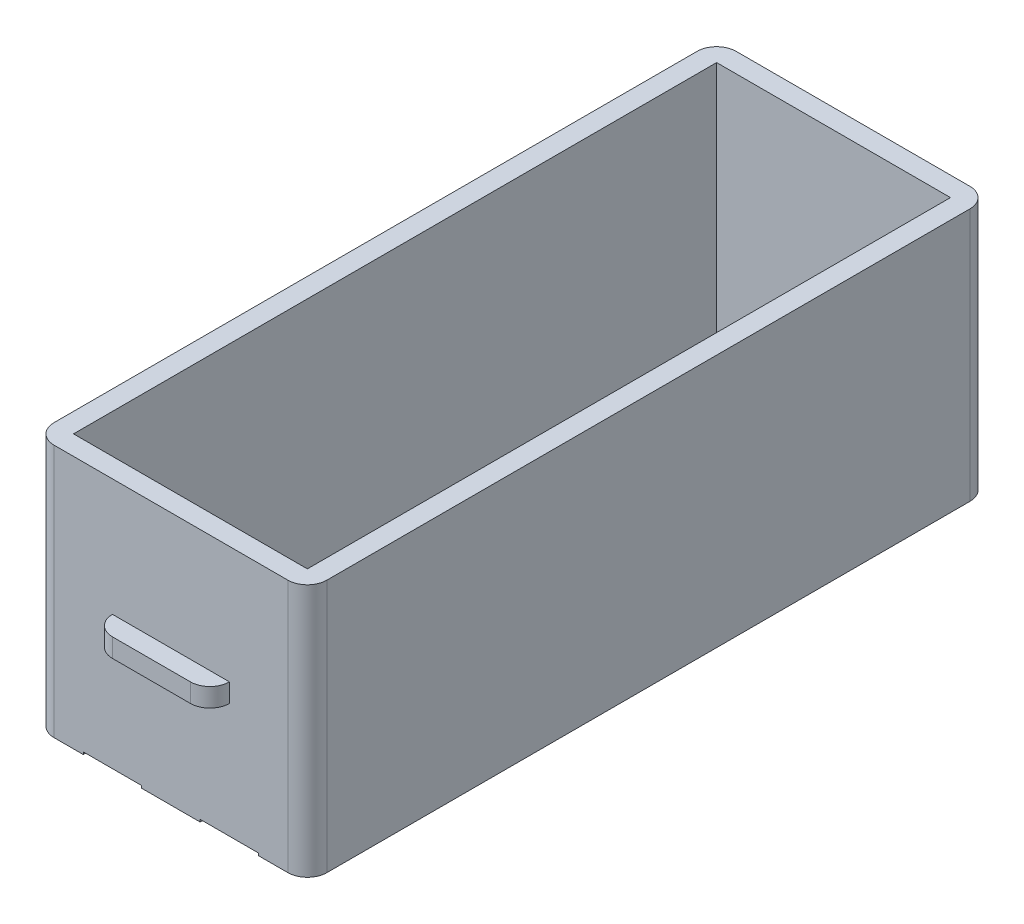
ISO-10303-21;
HEADER;
FILE_DESCRIPTION(('STEP AP214'),'2;1');
FILE_NAME('part.step','',(''),(''),'','','');
FILE_SCHEMA(('AUTOMOTIVE_DESIGN { 1 0 10303 214 1 1 1 1 }'));
ENDSEC;
DATA;
#1=APPLICATION_CONTEXT('core data for automotive mechanical design processes');
#2=APPLICATION_PROTOCOL_DEFINITION('international standard','automotive_design',2000,#1);
#3=PRODUCT_CONTEXT('',#1,'mechanical');
#4=PRODUCT('Part','Part','',(#3));
#5=PRODUCT_RELATED_PRODUCT_CATEGORY('part','',(#4));
#6=PRODUCT_DEFINITION_FORMATION('','',#4);
#7=PRODUCT_DEFINITION_CONTEXT('part definition',#1,'design');
#8=PRODUCT_DEFINITION('design','',#6,#7);
#9=PRODUCT_DEFINITION_SHAPE('','',#8);
#10=(LENGTH_UNIT() NAMED_UNIT(*) SI_UNIT(.MILLI.,.METRE.));
#11=(NAMED_UNIT(*) PLANE_ANGLE_UNIT() SI_UNIT($,.RADIAN.));
#12=(NAMED_UNIT(*) SI_UNIT($,.STERADIAN.) SOLID_ANGLE_UNIT());
#13=UNCERTAINTY_MEASURE_WITH_UNIT(LENGTH_MEASURE(1.E-05),#10,'distance_accuracy_value','');
#14=(GEOMETRIC_REPRESENTATION_CONTEXT(3) GLOBAL_UNCERTAINTY_ASSIGNED_CONTEXT((#13)) GLOBAL_UNIT_ASSIGNED_CONTEXT((#10,
#11,#12)) REPRESENTATION_CONTEXT('',''));
#15=CARTESIAN_POINT('',(0.,0.,0.));
#16=DIRECTION('',(0.,0.,1.));
#17=DIRECTION('',(1.,0.,0.));
#18=AXIS2_PLACEMENT_3D('',#15,#16,#17);
#19=CARTESIAN_POINT('',(-44.45,-41.275,111.125));
#20=DIRECTION('',(0.,1.,0.));
#21=DIRECTION('',(0.,0.,1.));
#22=AXIS2_PLACEMENT_3D('',#19,#20,#21);
#23=PLANE('',#22);
#24=DIRECTION('',(0.,0.,-1.));
#25=VECTOR('',#24,1.);
#26=CARTESIAN_POINT('',(-44.45,-41.275,111.125));
#27=LINE('',#26,#25);
#28=CARTESIAN_POINT('',(-44.45,-41.275,104.775));
#29=VERTEX_POINT('',#28);
#30=CARTESIAN_POINT('',(-44.45,-41.275,-104.775));
#31=VERTEX_POINT('',#30);
#32=EDGE_CURVE('E247',#29,#31,#27,.T.);
#33=ORIENTED_EDGE('',*,*,#32,.T.);
#34=CARTESIAN_POINT('',(-38.1,-41.275,-104.775));
#35=DIRECTION('',(0.,1.,0.));
#36=DIRECTION('',(0.,0.,1.));
#37=AXIS2_PLACEMENT_3D('',#34,#35,#36);
#38=CIRCLE('',#37,6.35);
#39=CARTESIAN_POINT('',(-38.1,-41.275,-111.125));
#40=VERTEX_POINT('',#39);
#41=EDGE_CURVE('E281',#31,#40,#38,.F.);
#42=ORIENTED_EDGE('',*,*,#41,.T.);
#43=DIRECTION('',(1.,0.,0.));
#44=VECTOR('',#43,1.);
#45=CARTESIAN_POINT('',(-44.45,-41.275,-111.125));
#46=LINE('',#45,#44);
#47=CARTESIAN_POINT('',(-28.575,-41.275,-111.125));
#48=VERTEX_POINT('',#47);
#49=EDGE_CURVE('E231',#40,#48,#46,.T.);
#50=ORIENTED_EDGE('',*,*,#49,.T.);
#51=DIRECTION('',(0.,0.,1.));
#52=VECTOR('',#51,1.);
#53=CARTESIAN_POINT('',(-28.575,-41.275,-111.125));
#54=LINE('',#53,#52);
#55=CARTESIAN_POINT('',(-28.575,-41.275,111.125));
#56=VERTEX_POINT('',#55);
#57=EDGE_CURVE('E400',#48,#56,#54,.T.);
#58=ORIENTED_EDGE('',*,*,#57,.T.);
#59=DIRECTION('',(1.,0.,0.));
#60=VECTOR('',#59,1.);
#61=CARTESIAN_POINT('',(-44.45,-41.275,111.125));
#62=LINE('',#61,#60);
#63=CARTESIAN_POINT('',(-38.1,-41.275,111.125));
#64=VERTEX_POINT('',#63);
#65=EDGE_CURVE('E244',#64,#56,#62,.T.);
#66=ORIENTED_EDGE('',*,*,#65,.F.);
#67=CARTESIAN_POINT('',(-38.1,-41.275,104.775));
#68=DIRECTION('',(0.,1.,0.));
#69=DIRECTION('',(0.,0.,1.));
#70=AXIS2_PLACEMENT_3D('',#67,#68,#69);
#71=CIRCLE('',#70,6.35);
#72=EDGE_CURVE('E279',#64,#29,#71,.F.);
#73=ORIENTED_EDGE('',*,*,#72,.T.);
#74=EDGE_LOOP('',(#33,#42,#50,#58,#66,#73));
#75=FACE_BOUND('',#74,.T.);
#76=ADVANCED_FACE('F42',(#75),#23,.F.);
#77=CARTESIAN_POINT('',(28.575,-41.275,-111.125));
#78=VERTEX_POINT('',#77);
#79=CARTESIAN_POINT('',(38.1,-41.275,-111.125));
#80=VERTEX_POINT('',#79);
#81=EDGE_CURVE('E232',#78,#80,#46,.T.);
#82=ORIENTED_EDGE('',*,*,#81,.T.);
#83=CARTESIAN_POINT('',(38.1,-41.275,-104.775));
#84=DIRECTION('',(0.,1.,0.));
#85=DIRECTION('',(0.,0.,1.));
#86=AXIS2_PLACEMENT_3D('',#83,#84,#85);
#87=CIRCLE('',#86,6.35);
#88=CARTESIAN_POINT('',(44.45,-41.275,-104.775));
#89=VERTEX_POINT('',#88);
#90=EDGE_CURVE('E272',#80,#89,#87,.F.);
#91=ORIENTED_EDGE('',*,*,#90,.T.);
#92=DIRECTION('',(0.,0.,-1.));
#93=VECTOR('',#92,1.);
#94=CARTESIAN_POINT('',(44.45,-41.275,111.125));
#95=LINE('',#94,#93);
#96=CARTESIAN_POINT('',(44.45,-41.275,104.775));
#97=VERTEX_POINT('',#96);
#98=EDGE_CURVE('E243',#97,#89,#95,.T.);
#99=ORIENTED_EDGE('',*,*,#98,.F.);
#100=CARTESIAN_POINT('',(38.1,-41.275,104.775));
#101=DIRECTION('',(0.,1.,0.));
#102=DIRECTION('',(0.,0.,1.));
#103=AXIS2_PLACEMENT_3D('',#100,#101,#102);
#104=CIRCLE('',#103,6.35);
#105=CARTESIAN_POINT('',(38.1,-41.275,111.125));
#106=VERTEX_POINT('',#105);
#107=EDGE_CURVE('E270',#97,#106,#104,.F.);
#108=ORIENTED_EDGE('',*,*,#107,.T.);
#109=CARTESIAN_POINT('',(28.575,-41.275,111.125));
#110=VERTEX_POINT('',#109);
#111=EDGE_CURVE('E349',#110,#106,#62,.T.);
#112=ORIENTED_EDGE('',*,*,#111,.F.);
#113=DIRECTION('',(0.,0.,1.));
#114=VECTOR('',#113,1.);
#115=CARTESIAN_POINT('',(28.575,-41.275,-111.125));
#116=LINE('',#115,#114);
#117=EDGE_CURVE('E418',#78,#110,#116,.T.);
#118=ORIENTED_EDGE('',*,*,#117,.F.);
#119=EDGE_LOOP('',(#82,#91,#99,#108,#112,#118));
#120=FACE_BOUND('',#119,.T.);
#121=ADVANCED_FACE('F455',(#120),#23,.F.);
#122=CARTESIAN_POINT('',(0.,0.,111.125));
#123=DIRECTION('',(0.,0.,1.));
#124=DIRECTION('',(1.,0.,0.));
#125=AXIS2_PLACEMENT_3D('',#122,#123,#124);
#126=PLANE('',#125);
#127=DIRECTION('',(-1.,0.,0.));
#128=VECTOR('',#127,1.);
#129=CARTESIAN_POINT('',(44.45,41.275,111.125));
#130=LINE('',#129,#128);
#131=CARTESIAN_POINT('',(38.1,41.275,111.125));
#132=VERTEX_POINT('',#131);
#133=CARTESIAN_POINT('',(-38.1,41.275,111.125));
#134=VERTEX_POINT('',#133);
#135=EDGE_CURVE('E234',#132,#134,#130,.T.);
#136=ORIENTED_EDGE('',*,*,#135,.T.);
#137=DIRECTION('',(0.,-1.,0.));
#138=VECTOR('',#137,1.);
#139=CARTESIAN_POINT('',(-38.1,-41.275,111.125));
#140=LINE('',#139,#138);
#141=EDGE_CURVE('E286',#134,#64,#140,.T.);
#142=ORIENTED_EDGE('',*,*,#141,.T.);
#143=ORIENTED_EDGE('',*,*,#65,.T.);
#144=DIRECTION('',(0.,-1.,0.));
#145=VECTOR('',#144,1.);
#146=CARTESIAN_POINT('',(-28.575,-41.275,111.125));
#147=LINE('',#146,#145);
#148=CARTESIAN_POINT('',(-28.575,-40.513,111.125));
#149=VERTEX_POINT('',#148);
#150=EDGE_CURVE('E213',#149,#56,#147,.T.);
#151=ORIENTED_EDGE('',*,*,#150,.F.);
#152=DIRECTION('',(-1.,0.,0.));
#153=VECTOR('',#152,1.);
#154=CARTESIAN_POINT('',(-28.575,-40.513,111.125));
#155=LINE('',#154,#153);
#156=CARTESIAN_POINT('',(-9.52499999999999,-40.513,111.125));
#157=VERTEX_POINT('',#156);
#158=EDGE_CURVE('E695',#157,#149,#155,.T.);
#159=ORIENTED_EDGE('',*,*,#158,.F.);
#160=DIRECTION('',(0.,1.,0.));
#161=VECTOR('',#160,1.);
#162=CARTESIAN_POINT('',(-9.52499999999999,-40.513,111.125));
#163=LINE('',#162,#161);
#164=CARTESIAN_POINT('',(-9.52499999999999,-41.275,111.125));
#165=VERTEX_POINT('',#164);
#166=EDGE_CURVE('E429',#165,#157,#163,.T.);
#167=ORIENTED_EDGE('',*,*,#166,.F.);
#168=CARTESIAN_POINT('',(9.52500000000001,-41.275,111.125));
#169=VERTEX_POINT('',#168);
#170=EDGE_CURVE('E222',#165,#169,#62,.T.);
#171=ORIENTED_EDGE('',*,*,#170,.T.);
#172=DIRECTION('',(0.,-1.,0.));
#173=VECTOR('',#172,1.);
#174=CARTESIAN_POINT('',(9.52500000000001,-40.513,111.125));
#175=LINE('',#174,#173);
#176=CARTESIAN_POINT('',(9.52500000000001,-40.513,111.125));
#177=VERTEX_POINT('',#176);
#178=EDGE_CURVE('E423',#177,#169,#175,.T.);
#179=ORIENTED_EDGE('',*,*,#178,.F.);
#180=DIRECTION('',(-1.,0.,0.));
#181=VECTOR('',#180,1.);
#182=CARTESIAN_POINT('',(28.575,-40.513,111.125));
#183=LINE('',#182,#181);
#184=CARTESIAN_POINT('',(28.575,-40.513,111.125));
#185=VERTEX_POINT('',#184);
#186=EDGE_CURVE('E426',#185,#177,#183,.T.);
#187=ORIENTED_EDGE('',*,*,#186,.F.);
#188=DIRECTION('',(0.,1.,0.));
#189=VECTOR('',#188,1.);
#190=CARTESIAN_POINT('',(28.575,-41.275,111.125));
#191=LINE('',#190,#189);
#192=EDGE_CURVE('E361',#110,#185,#191,.T.);
#193=ORIENTED_EDGE('',*,*,#192,.F.);
#194=ORIENTED_EDGE('',*,*,#111,.T.);
#195=DIRECTION('',(0.,1.,0.));
#196=VECTOR('',#195,1.);
#197=CARTESIAN_POINT('',(38.1,41.275,111.125));
#198=LINE('',#197,#196);
#199=EDGE_CURVE('E283',#106,#132,#198,.T.);
#200=ORIENTED_EDGE('',*,*,#199,.T.);
#201=EDGE_LOOP('',(#136,#142,#143,#151,#159,#167,#171,#179,#187,#193,#194,#200));
#202=FACE_BOUND('',#201,.T.);
#203=DIRECTION('',(0.,1.,0.));
#204=VECTOR('',#203,1.);
#205=CARTESIAN_POINT('',(-19.05,0.,111.125));
#206=LINE('',#205,#204);
#207=CARTESIAN_POINT('',(-19.05,-3.048,111.125));
#208=VERTEX_POINT('',#207);
#209=CARTESIAN_POINT('',(-19.05,3.048,111.125));
#210=VERTEX_POINT('',#209);
#211=EDGE_CURVE('E306',#208,#210,#206,.T.);
#212=ORIENTED_EDGE('',*,*,#211,.T.);
#213=DIRECTION('',(1.,0.,0.));
#214=VECTOR('',#213,1.);
#215=CARTESIAN_POINT('',(0.,3.048,111.125));
#216=LINE('',#215,#214);
#217=CARTESIAN_POINT('',(19.05,3.048,111.125));
#218=VERTEX_POINT('',#217);
#219=EDGE_CURVE('E311',#210,#218,#216,.T.);
#220=ORIENTED_EDGE('',*,*,#219,.T.);
#221=DIRECTION('',(0.,-1.,0.));
#222=VECTOR('',#221,1.);
#223=CARTESIAN_POINT('',(19.05,0.,111.125));
#224=LINE('',#223,#222);
#225=CARTESIAN_POINT('',(19.05,-3.048,111.125));
#226=VERTEX_POINT('',#225);
#227=EDGE_CURVE('E309',#218,#226,#224,.T.);
#228=ORIENTED_EDGE('',*,*,#227,.T.);
#229=DIRECTION('',(-1.,0.,0.));
#230=VECTOR('',#229,1.);
#231=CARTESIAN_POINT('',(0.,-3.048,111.125));
#232=LINE('',#231,#230);
#233=EDGE_CURVE('E299',#226,#208,#232,.T.);
#234=ORIENTED_EDGE('',*,*,#233,.T.);
#235=EDGE_LOOP('',(#212,#220,#228,#234));
#236=FACE_BOUND('',#235,.T.);
#237=ADVANCED_FACE('F304',(#202,#236),#126,.T.);
#238=CARTESIAN_POINT('',(44.45,41.275,111.125));
#239=DIRECTION('',(0.,-1.,0.));
#240=DIRECTION('',(1.,0.,0.));
#241=AXIS2_PLACEMENT_3D('',#238,#239,#240);
#242=PLANE('',#241);
#243=DIRECTION('',(0.,0.,1.));
#244=VECTOR('',#243,1.);
#245=CARTESIAN_POINT('',(-38.1,41.275,-104.775));
#246=LINE('',#245,#244);
#247=CARTESIAN_POINT('',(-38.1,41.275,-104.775));
#248=VERTEX_POINT('',#247);
#249=CARTESIAN_POINT('',(-38.1,41.275,104.775));
#250=VERTEX_POINT('',#249);
#251=EDGE_CURVE('E332',#248,#250,#246,.T.);
#252=ORIENTED_EDGE('',*,*,#251,.F.);
#253=DIRECTION('',(-1.,0.,0.));
#254=VECTOR('',#253,1.);
#255=CARTESIAN_POINT('',(38.1,41.275,-104.775));
#256=LINE('',#255,#254);
#257=CARTESIAN_POINT('',(38.1,41.275,-104.775));
#258=VERTEX_POINT('',#257);
#259=EDGE_CURVE('E313',#258,#248,#256,.T.);
#260=ORIENTED_EDGE('',*,*,#259,.F.);
#261=DIRECTION('',(0.,0.,-1.));
#262=VECTOR('',#261,1.);
#263=CARTESIAN_POINT('',(38.1,41.275,104.775));
#264=LINE('',#263,#262);
#265=CARTESIAN_POINT('',(38.1,41.275,104.775));
#266=VERTEX_POINT('',#265);
#267=EDGE_CURVE('E321',#266,#258,#264,.T.);
#268=ORIENTED_EDGE('',*,*,#267,.F.);
#269=DIRECTION('',(1.,0.,0.));
#270=VECTOR('',#269,1.);
#271=CARTESIAN_POINT('',(-38.1,41.275,104.775));
#272=LINE('',#271,#270);
#273=EDGE_CURVE('E335',#250,#266,#272,.T.);
#274=ORIENTED_EDGE('',*,*,#273,.F.);
#275=EDGE_LOOP('',(#252,#260,#268,#274));
#276=FACE_BOUND('',#275,.T.);
#277=DIRECTION('',(0.,0.,-1.));
#278=VECTOR('',#277,1.);
#279=CARTESIAN_POINT('',(44.45,41.275,111.125));
#280=LINE('',#279,#278);
#281=CARTESIAN_POINT('',(44.45,41.275,104.775));
#282=VERTEX_POINT('',#281);
#283=CARTESIAN_POINT('',(44.45,41.275,-104.775));
#284=VERTEX_POINT('',#283);
#285=EDGE_CURVE('E240',#282,#284,#280,.T.);
#286=ORIENTED_EDGE('',*,*,#285,.T.);
#287=CARTESIAN_POINT('',(38.1,41.275,-104.775));
#288=DIRECTION('',(0.,-1.,0.));
#289=DIRECTION('',(1.,0.,0.));
#290=AXIS2_PLACEMENT_3D('',#287,#288,#289);
#291=CIRCLE('',#290,6.35);
#292=CARTESIAN_POINT('',(38.1,41.275,-111.125));
#293=VERTEX_POINT('',#292);
#294=EDGE_CURVE('E264',#284,#293,#291,.F.);
#295=ORIENTED_EDGE('',*,*,#294,.T.);
#296=DIRECTION('',(-1.,0.,0.));
#297=VECTOR('',#296,1.);
#298=CARTESIAN_POINT('',(44.45,41.275,-111.125));
#299=LINE('',#298,#297);
#300=CARTESIAN_POINT('',(-38.1,41.275,-111.125));
#301=VERTEX_POINT('',#300);
#302=EDGE_CURVE('E236',#293,#301,#299,.T.);
#303=ORIENTED_EDGE('',*,*,#302,.T.);
#304=CARTESIAN_POINT('',(-38.1,41.275,-104.775));
#305=DIRECTION('',(0.,-1.,0.));
#306=DIRECTION('',(1.,0.,0.));
#307=AXIS2_PLACEMENT_3D('',#304,#305,#306);
#308=CIRCLE('',#307,6.35);
#309=CARTESIAN_POINT('',(-44.45,41.275,-104.775));
#310=VERTEX_POINT('',#309);
#311=EDGE_CURVE('E262',#301,#310,#308,.F.);
#312=ORIENTED_EDGE('',*,*,#311,.T.);
#313=DIRECTION('',(0.,0.,-1.));
#314=VECTOR('',#313,1.);
#315=CARTESIAN_POINT('',(-44.45,41.275,111.125));
#316=LINE('',#315,#314);
#317=CARTESIAN_POINT('',(-44.45,41.275,104.775));
#318=VERTEX_POINT('',#317);
#319=EDGE_CURVE('E250',#318,#310,#316,.T.);
#320=ORIENTED_EDGE('',*,*,#319,.F.);
#321=CARTESIAN_POINT('',(-38.1,41.275,104.775));
#322=DIRECTION('',(0.,-1.,0.));
#323=DIRECTION('',(1.,0.,0.));
#324=AXIS2_PLACEMENT_3D('',#321,#322,#323);
#325=CIRCLE('',#324,6.35);
#326=EDGE_CURVE('E260',#318,#134,#325,.F.);
#327=ORIENTED_EDGE('',*,*,#326,.T.);
#328=ORIENTED_EDGE('',*,*,#135,.F.);
#329=CARTESIAN_POINT('',(38.1,41.275,104.775));
#330=DIRECTION('',(0.,-1.,0.));
#331=DIRECTION('',(1.,0.,0.));
#332=AXIS2_PLACEMENT_3D('',#329,#330,#331);
#333=CIRCLE('',#332,6.35);
#334=EDGE_CURVE('E258',#132,#282,#333,.F.);
#335=ORIENTED_EDGE('',*,*,#334,.T.);
#336=EDGE_LOOP('',(#286,#295,#303,#312,#320,#327,#328,#335));
#337=FACE_BOUND('',#336,.T.);
#338=ADVANCED_FACE('F370',(#276,#337),#242,.F.);
#339=CARTESIAN_POINT('',(-44.45,41.275,111.125));
#340=DIRECTION('',(1.,0.,0.));
#341=DIRECTION('',(0.,1.,0.));
#342=AXIS2_PLACEMENT_3D('',#339,#340,#341);
#343=PLANE('',#342);
#344=ORIENTED_EDGE('',*,*,#319,.T.);
#345=DIRECTION('',(0.,-1.,0.));
#346=VECTOR('',#345,1.);
#347=CARTESIAN_POINT('',(-44.45,41.275,-104.775));
#348=LINE('',#347,#346);
#349=EDGE_CURVE('E276',#310,#31,#348,.T.);
#350=ORIENTED_EDGE('',*,*,#349,.T.);
#351=ORIENTED_EDGE('',*,*,#32,.F.);
#352=DIRECTION('',(0.,-1.,0.));
#353=VECTOR('',#352,1.);
#354=CARTESIAN_POINT('',(-44.45,41.275,104.775));
#355=LINE('',#354,#353);
#356=EDGE_CURVE('E274',#29,#318,#355,.F.);
#357=ORIENTED_EDGE('',*,*,#356,.T.);
#358=EDGE_LOOP('',(#344,#350,#351,#357));
#359=FACE_BOUND('',#358,.T.);
#360=ADVANCED_FACE('F391',(#359),#343,.F.);
#361=ORIENTED_EDGE('',*,*,#170,.F.);
#362=DIRECTION('',(0.,0.,1.));
#363=VECTOR('',#362,1.);
#364=CARTESIAN_POINT('',(-9.52499999999999,-41.275,-111.125));
#365=LINE('',#364,#363);
#366=CARTESIAN_POINT('',(-9.52499999999999,-41.275,-111.125));
#367=VERTEX_POINT('',#366);
#368=EDGE_CURVE('E206',#367,#165,#365,.T.);
#369=ORIENTED_EDGE('',*,*,#368,.F.);
#370=CARTESIAN_POINT('',(9.52500000000001,-41.275,-111.125));
#371=VERTEX_POINT('',#370);
#372=EDGE_CURVE('E220',#367,#371,#46,.T.);
#373=ORIENTED_EDGE('',*,*,#372,.T.);
#374=DIRECTION('',(0.,0.,1.));
#375=VECTOR('',#374,1.);
#376=CARTESIAN_POINT('',(9.52500000000001,-41.275,-111.125));
#377=LINE('',#376,#375);
#378=EDGE_CURVE('E416',#371,#169,#377,.T.);
#379=ORIENTED_EDGE('',*,*,#378,.T.);
#380=EDGE_LOOP('',(#361,#369,#373,#379));
#381=FACE_BOUND('',#380,.T.);
#382=ADVANCED_FACE('F218',(#381),#23,.F.);
#383=CARTESIAN_POINT('',(44.45,-41.275,111.125));
#384=DIRECTION('',(-1.,0.,0.));
#385=DIRECTION('',(0.,0.,1.));
#386=AXIS2_PLACEMENT_3D('',#383,#384,#385);
#387=PLANE('',#386);
#388=ORIENTED_EDGE('',*,*,#98,.T.);
#389=DIRECTION('',(0.,1.,0.));
#390=VECTOR('',#389,1.);
#391=CARTESIAN_POINT('',(44.45,-41.275,-104.775));
#392=LINE('',#391,#390);
#393=EDGE_CURVE('E255',#89,#284,#392,.T.);
#394=ORIENTED_EDGE('',*,*,#393,.T.);
#395=ORIENTED_EDGE('',*,*,#285,.F.);
#396=DIRECTION('',(0.,1.,0.));
#397=VECTOR('',#396,1.);
#398=CARTESIAN_POINT('',(44.45,-41.275,104.775));
#399=LINE('',#398,#397);
#400=EDGE_CURVE('E253',#282,#97,#399,.F.);
#401=ORIENTED_EDGE('',*,*,#400,.T.);
#402=EDGE_LOOP('',(#388,#394,#395,#401));
#403=FACE_BOUND('',#402,.T.);
#404=ADVANCED_FACE('F372',(#403),#387,.F.);
#405=CARTESIAN_POINT('',(0.,0.,-111.125));
#406=DIRECTION('',(0.,0.,1.));
#407=DIRECTION('',(1.,0.,0.));
#408=AXIS2_PLACEMENT_3D('',#405,#406,#407);
#409=PLANE('',#408);
#410=ORIENTED_EDGE('',*,*,#302,.F.);
#411=DIRECTION('',(0.,1.,0.));
#412=VECTOR('',#411,1.);
#413=CARTESIAN_POINT('',(38.1,0.,-111.125));
#414=LINE('',#413,#412);
#415=EDGE_CURVE('E268',#293,#80,#414,.F.);
#416=ORIENTED_EDGE('',*,*,#415,.T.);
#417=ORIENTED_EDGE('',*,*,#81,.F.);
#418=DIRECTION('',(0.,1.,0.));
#419=VECTOR('',#418,1.);
#420=CARTESIAN_POINT('',(28.575,-41.275,-111.125));
#421=LINE('',#420,#419);
#422=CARTESIAN_POINT('',(28.575,-40.513,-111.125));
#423=VERTEX_POINT('',#422);
#424=EDGE_CURVE('E415',#78,#423,#421,.T.);
#425=ORIENTED_EDGE('',*,*,#424,.T.);
#426=DIRECTION('',(-1.,0.,0.));
#427=VECTOR('',#426,1.);
#428=CARTESIAN_POINT('',(28.575,-40.513,-111.125));
#429=LINE('',#428,#427);
#430=CARTESIAN_POINT('',(9.52500000000001,-40.513,-111.125));
#431=VERTEX_POINT('',#430);
#432=EDGE_CURVE('E424',#423,#431,#429,.T.);
#433=ORIENTED_EDGE('',*,*,#432,.T.);
#434=DIRECTION('',(0.,-1.,0.));
#435=VECTOR('',#434,1.);
#436=CARTESIAN_POINT('',(9.52500000000001,-40.513,-111.125));
#437=LINE('',#436,#435);
#438=EDGE_CURVE('E230',#431,#371,#437,.T.);
#439=ORIENTED_EDGE('',*,*,#438,.T.);
#440=ORIENTED_EDGE('',*,*,#372,.F.);
#441=DIRECTION('',(0.,1.,0.));
#442=VECTOR('',#441,1.);
#443=CARTESIAN_POINT('',(-9.52499999999999,-40.513,-111.125));
#444=LINE('',#443,#442);
#445=CARTESIAN_POINT('',(-9.52499999999999,-40.513,-111.125));
#446=VERTEX_POINT('',#445);
#447=EDGE_CURVE('E202',#367,#446,#444,.T.);
#448=ORIENTED_EDGE('',*,*,#447,.T.);
#449=DIRECTION('',(-1.,0.,0.));
#450=VECTOR('',#449,1.);
#451=CARTESIAN_POINT('',(-28.575,-40.513,-111.125));
#452=LINE('',#451,#450);
#453=CARTESIAN_POINT('',(-28.575,-40.513,-111.125));
#454=VERTEX_POINT('',#453);
#455=EDGE_CURVE('E212',#446,#454,#452,.T.);
#456=ORIENTED_EDGE('',*,*,#455,.T.);
#457=DIRECTION('',(0.,-1.,0.));
#458=VECTOR('',#457,1.);
#459=CARTESIAN_POINT('',(-28.575,-41.275,-111.125));
#460=LINE('',#459,#458);
#461=EDGE_CURVE('E223',#454,#48,#460,.T.);
#462=ORIENTED_EDGE('',*,*,#461,.T.);
#463=ORIENTED_EDGE('',*,*,#49,.F.);
#464=DIRECTION('',(0.,-1.,0.));
#465=VECTOR('',#464,1.);
#466=CARTESIAN_POINT('',(-38.1,0.,-111.125));
#467=LINE('',#466,#465);
#468=EDGE_CURVE('E266',#40,#301,#467,.F.);
#469=ORIENTED_EDGE('',*,*,#468,.T.);
#470=EDGE_LOOP('',(#410,#416,#417,#425,#433,#439,#440,#448,#456,#462,#463,#469));
#471=FACE_BOUND('',#470,.T.);
#472=ADVANCED_FACE('F227',(#471),#409,.F.);
#473=CARTESIAN_POINT('',(38.1,-34.925,-104.775));
#474=DIRECTION('',(0.,0.,-1.));
#475=DIRECTION('',(-1.,0.,0.));
#476=AXIS2_PLACEMENT_3D('',#473,#474,#475);
#477=PLANE('',#476);
#478=ORIENTED_EDGE('',*,*,#259,.T.);
#479=DIRECTION('',(0.,1.,0.));
#480=VECTOR('',#479,1.);
#481=CARTESIAN_POINT('',(-38.1,-34.925,-104.775));
#482=LINE('',#481,#480);
#483=CARTESIAN_POINT('',(-38.1,-34.925,-104.775));
#484=VERTEX_POINT('',#483);
#485=EDGE_CURVE('E330',#484,#248,#482,.T.);
#486=ORIENTED_EDGE('',*,*,#485,.F.);
#487=DIRECTION('',(-1.,0.,0.));
#488=VECTOR('',#487,1.);
#489=CARTESIAN_POINT('',(38.1,-34.925,-104.775));
#490=LINE('',#489,#488);
#491=CARTESIAN_POINT('',(38.1,-34.925,-104.775));
#492=VERTEX_POINT('',#491);
#493=EDGE_CURVE('E317',#492,#484,#490,.T.);
#494=ORIENTED_EDGE('',*,*,#493,.F.);
#495=DIRECTION('',(0.,1.,0.));
#496=VECTOR('',#495,1.);
#497=CARTESIAN_POINT('',(38.1,-34.925,-104.775));
#498=LINE('',#497,#496);
#499=EDGE_CURVE('E340',#492,#258,#498,.T.);
#500=ORIENTED_EDGE('',*,*,#499,.T.);
#501=EDGE_LOOP('',(#478,#486,#494,#500));
#502=FACE_BOUND('',#501,.T.);
#503=ADVANCED_FACE('F641',(#502),#477,.F.);
#504=CARTESIAN_POINT('',(38.1,-34.925,104.775));
#505=DIRECTION('',(1.,0.,0.));
#506=DIRECTION('',(0.,1.,0.));
#507=AXIS2_PLACEMENT_3D('',#504,#505,#506);
#508=PLANE('',#507);
#509=ORIENTED_EDGE('',*,*,#267,.T.);
#510=ORIENTED_EDGE('',*,*,#499,.F.);
#511=DIRECTION('',(0.,0.,-1.));
#512=VECTOR('',#511,1.);
#513=CARTESIAN_POINT('',(38.1,-34.925,104.775));
#514=LINE('',#513,#512);
#515=CARTESIAN_POINT('',(38.1,-34.925,104.775));
#516=VERTEX_POINT('',#515);
#517=EDGE_CURVE('E327',#516,#492,#514,.T.);
#518=ORIENTED_EDGE('',*,*,#517,.F.);
#519=DIRECTION('',(0.,1.,0.));
#520=VECTOR('',#519,1.);
#521=CARTESIAN_POINT('',(38.1,-34.925,104.775));
#522=LINE('',#521,#520);
#523=EDGE_CURVE('E342',#516,#266,#522,.T.);
#524=ORIENTED_EDGE('',*,*,#523,.T.);
#525=EDGE_LOOP('',(#509,#510,#518,#524));
#526=FACE_BOUND('',#525,.T.);
#527=ADVANCED_FACE('F632',(#526),#508,.F.);
#528=CARTESIAN_POINT('',(-38.1,-34.925,104.775));
#529=DIRECTION('',(0.,0.,1.));
#530=DIRECTION('',(1.,0.,0.));
#531=AXIS2_PLACEMENT_3D('',#528,#529,#530);
#532=PLANE('',#531);
#533=ORIENTED_EDGE('',*,*,#273,.T.);
#534=ORIENTED_EDGE('',*,*,#523,.F.);
#535=DIRECTION('',(1.,0.,0.));
#536=VECTOR('',#535,1.);
#537=CARTESIAN_POINT('',(-38.1,-34.925,104.775));
#538=LINE('',#537,#536);
#539=CARTESIAN_POINT('',(-38.1,-34.925,104.775));
#540=VERTEX_POINT('',#539);
#541=EDGE_CURVE('E324',#540,#516,#538,.T.);
#542=ORIENTED_EDGE('',*,*,#541,.F.);
#543=DIRECTION('',(0.,1.,0.));
#544=VECTOR('',#543,1.);
#545=CARTESIAN_POINT('',(-38.1,-34.925,104.775));
#546=LINE('',#545,#544);
#547=EDGE_CURVE('E344',#540,#250,#546,.T.);
#548=ORIENTED_EDGE('',*,*,#547,.T.);
#549=EDGE_LOOP('',(#533,#534,#542,#548));
#550=FACE_BOUND('',#549,.T.);
#551=ADVANCED_FACE('F622',(#550),#532,.F.);
#552=CARTESIAN_POINT('',(-38.1,-34.925,-104.775));
#553=DIRECTION('',(-1.,0.,0.));
#554=DIRECTION('',(0.,0.,1.));
#555=AXIS2_PLACEMENT_3D('',#552,#553,#554);
#556=PLANE('',#555);
#557=ORIENTED_EDGE('',*,*,#251,.T.);
#558=ORIENTED_EDGE('',*,*,#547,.F.);
#559=DIRECTION('',(0.,0.,1.));
#560=VECTOR('',#559,1.);
#561=CARTESIAN_POINT('',(-38.1,-34.925,-104.775));
#562=LINE('',#561,#560);
#563=EDGE_CURVE('E320',#484,#540,#562,.T.);
#564=ORIENTED_EDGE('',*,*,#563,.F.);
#565=ORIENTED_EDGE('',*,*,#485,.T.);
#566=EDGE_LOOP('',(#557,#558,#564,#565));
#567=FACE_BOUND('',#566,.T.);
#568=ADVANCED_FACE('F451',(#567),#556,.F.);
#569=CARTESIAN_POINT('',(0.,-34.925,0.));
#570=DIRECTION('',(0.,1.,0.));
#571=DIRECTION('',(-1.,0.,0.));
#572=AXIS2_PLACEMENT_3D('',#569,#570,#571);
#573=PLANE('',#572);
#574=ORIENTED_EDGE('',*,*,#493,.T.);
#575=ORIENTED_EDGE('',*,*,#563,.T.);
#576=ORIENTED_EDGE('',*,*,#541,.T.);
#577=ORIENTED_EDGE('',*,*,#517,.T.);
#578=EDGE_LOOP('',(#574,#575,#576,#577));
#579=FACE_BOUND('',#578,.T.);
#580=ADVANCED_FACE('F443',(#579),#573,.T.);
#581=CARTESIAN_POINT('',(19.05,3.048,117.475));
#582=DIRECTION('',(0.,-1.,0.));
#583=DIRECTION('',(1.,0.,0.));
#584=AXIS2_PLACEMENT_3D('',#581,#582,#583);
#585=PLANE('',#584);
#586=DIRECTION('',(-1.,0.,0.));
#587=VECTOR('',#586,1.);
#588=CARTESIAN_POINT('',(19.05,3.048,117.475));
#589=LINE('',#588,#587);
#590=CARTESIAN_POINT('',(12.7,3.048,117.475));
#591=VERTEX_POINT('',#590);
#592=CARTESIAN_POINT('',(-12.7,3.048,117.475));
#593=VERTEX_POINT('',#592);
#594=EDGE_CURVE('E403',#591,#593,#589,.T.);
#595=ORIENTED_EDGE('',*,*,#594,.F.);
#596=CARTESIAN_POINT('',(12.7,3.048,111.125));
#597=DIRECTION('',(0.,-1.,0.));
#598=DIRECTION('',(1.,0.,0.));
#599=AXIS2_PLACEMENT_3D('',#596,#597,#598);
#600=CIRCLE('',#599,6.35);
#601=EDGE_CURVE('E296',#591,#218,#600,.F.);
#602=ORIENTED_EDGE('',*,*,#601,.T.);
#603=ORIENTED_EDGE('',*,*,#219,.F.);
#604=CARTESIAN_POINT('',(-12.7,3.048,111.125));
#605=DIRECTION('',(0.,-1.,0.));
#606=DIRECTION('',(1.,0.,0.));
#607=AXIS2_PLACEMENT_3D('',#604,#605,#606);
#608=CIRCLE('',#607,6.35);
#609=EDGE_CURVE('E294',#210,#593,#608,.F.);
#610=ORIENTED_EDGE('',*,*,#609,.T.);
#611=EDGE_LOOP('',(#595,#602,#603,#610));
#612=FACE_BOUND('',#611,.T.);
#613=ADVANCED_FACE('F441',(#612),#585,.F.);
#614=CARTESIAN_POINT('',(-19.05,-3.048,117.475));
#615=DIRECTION('',(0.,1.,0.));
#616=DIRECTION('',(0.,0.,1.));
#617=AXIS2_PLACEMENT_3D('',#614,#615,#616);
#618=PLANE('',#617);
#619=ORIENTED_EDGE('',*,*,#233,.F.);
#620=CARTESIAN_POINT('',(12.7,-3.048,111.125));
#621=DIRECTION('',(0.,1.,0.));
#622=DIRECTION('',(0.,0.,1.));
#623=AXIS2_PLACEMENT_3D('',#620,#621,#622);
#624=CIRCLE('',#623,6.35);
#625=CARTESIAN_POINT('',(12.7,-3.048,117.475));
#626=VERTEX_POINT('',#625);
#627=EDGE_CURVE('E11',#226,#626,#624,.F.);
#628=ORIENTED_EDGE('',*,*,#627,.T.);
#629=DIRECTION('',(1.,0.,0.));
#630=VECTOR('',#629,1.);
#631=CARTESIAN_POINT('',(-19.05,-3.048,117.475));
#632=LINE('',#631,#630);
#633=CARTESIAN_POINT('',(-12.7,-3.048,117.475));
#634=VERTEX_POINT('',#633);
#635=EDGE_CURVE('E301',#634,#626,#632,.T.);
#636=ORIENTED_EDGE('',*,*,#635,.F.);
#637=CARTESIAN_POINT('',(-12.7,-3.048,111.125));
#638=DIRECTION('',(0.,1.,0.));
#639=DIRECTION('',(0.,0.,1.));
#640=AXIS2_PLACEMENT_3D('',#637,#638,#639);
#641=CIRCLE('',#640,6.35);
#642=EDGE_CURVE('E50',#634,#208,#641,.F.);
#643=ORIENTED_EDGE('',*,*,#642,.T.);
#644=EDGE_LOOP('',(#619,#628,#636,#643));
#645=FACE_BOUND('',#644,.T.);
#646=ADVANCED_FACE('F298',(#645),#618,.F.);
#647=CARTESIAN_POINT('',(0.,0.,117.475));
#648=DIRECTION('',(0.,0.,1.));
#649=DIRECTION('',(1.,0.,0.));
#650=AXIS2_PLACEMENT_3D('',#647,#648,#649);
#651=PLANE('',#650);
#652=ORIENTED_EDGE('',*,*,#635,.T.);
#653=DIRECTION('',(0.,1.,0.));
#654=VECTOR('',#653,1.);
#655=CARTESIAN_POINT('',(12.7,3.048,117.475));
#656=LINE('',#655,#654);
#657=EDGE_CURVE('E291',#626,#591,#656,.T.);
#658=ORIENTED_EDGE('',*,*,#657,.T.);
#659=ORIENTED_EDGE('',*,*,#594,.T.);
#660=DIRECTION('',(0.,-1.,0.));
#661=VECTOR('',#660,1.);
#662=CARTESIAN_POINT('',(-12.7,-3.048,117.475));
#663=LINE('',#662,#661);
#664=EDGE_CURVE('E289',#593,#634,#663,.T.);
#665=ORIENTED_EDGE('',*,*,#664,.T.);
#666=EDGE_LOOP('',(#652,#658,#659,#665));
#667=FACE_BOUND('',#666,.T.);
#668=ADVANCED_FACE('F436',(#667),#651,.T.);
#669=CARTESIAN_POINT('',(28.575,-40.513,-111.125));
#670=DIRECTION('',(0.,1.,0.));
#671=DIRECTION('',(0.,0.,1.));
#672=AXIS2_PLACEMENT_3D('',#669,#670,#671);
#673=PLANE('',#672);
#674=ORIENTED_EDGE('',*,*,#186,.T.);
#675=DIRECTION('',(0.,0.,1.));
#676=VECTOR('',#675,1.);
#677=CARTESIAN_POINT('',(9.52500000000001,-40.513,-111.125));
#678=LINE('',#677,#676);
#679=EDGE_CURVE('E413',#431,#177,#678,.T.);
#680=ORIENTED_EDGE('',*,*,#679,.F.);
#681=ORIENTED_EDGE('',*,*,#432,.F.);
#682=DIRECTION('',(0.,0.,1.));
#683=VECTOR('',#682,1.);
#684=CARTESIAN_POINT('',(28.575,-40.513,-111.125));
#685=LINE('',#684,#683);
#686=EDGE_CURVE('E420',#423,#185,#685,.T.);
#687=ORIENTED_EDGE('',*,*,#686,.T.);
#688=EDGE_LOOP('',(#674,#680,#681,#687));
#689=FACE_BOUND('',#688,.T.);
#690=ADVANCED_FACE('F566',(#689),#673,.F.);
#691=CARTESIAN_POINT('',(28.575,-41.275,-111.125));
#692=DIRECTION('',(1.,0.,0.));
#693=DIRECTION('',(0.,0.,-1.));
#694=AXIS2_PLACEMENT_3D('',#691,#692,#693);
#695=PLANE('',#694);
#696=ORIENTED_EDGE('',*,*,#192,.T.);
#697=ORIENTED_EDGE('',*,*,#686,.F.);
#698=ORIENTED_EDGE('',*,*,#424,.F.);
#699=ORIENTED_EDGE('',*,*,#117,.T.);
#700=EDGE_LOOP('',(#696,#697,#698,#699));
#701=FACE_BOUND('',#700,.T.);
#702=ADVANCED_FACE('F556',(#701),#695,.F.);
#703=CARTESIAN_POINT('',(9.52500000000001,-40.513,-111.125));
#704=DIRECTION('',(-1.,0.,0.));
#705=DIRECTION('',(0.,0.,1.));
#706=AXIS2_PLACEMENT_3D('',#703,#704,#705);
#707=PLANE('',#706);
#708=ORIENTED_EDGE('',*,*,#178,.T.);
#709=ORIENTED_EDGE('',*,*,#378,.F.);
#710=ORIENTED_EDGE('',*,*,#438,.F.);
#711=ORIENTED_EDGE('',*,*,#679,.T.);
#712=EDGE_LOOP('',(#708,#709,#710,#711));
#713=FACE_BOUND('',#712,.T.);
#714=ADVANCED_FACE('F547',(#713),#707,.F.);
#715=CARTESIAN_POINT('',(-28.575,-41.275,-111.125));
#716=DIRECTION('',(-1.,0.,0.));
#717=DIRECTION('',(0.,0.,1.));
#718=AXIS2_PLACEMENT_3D('',#715,#716,#717);
#719=PLANE('',#718);
#720=ORIENTED_EDGE('',*,*,#150,.T.);
#721=ORIENTED_EDGE('',*,*,#57,.F.);
#722=ORIENTED_EDGE('',*,*,#461,.F.);
#723=DIRECTION('',(0.,0.,1.));
#724=VECTOR('',#723,1.);
#725=CARTESIAN_POINT('',(-28.575,-40.513,-111.125));
#726=LINE('',#725,#724);
#727=EDGE_CURVE('E404',#454,#149,#726,.T.);
#728=ORIENTED_EDGE('',*,*,#727,.T.);
#729=EDGE_LOOP('',(#720,#721,#722,#728));
#730=FACE_BOUND('',#729,.T.);
#731=ADVANCED_FACE('F537',(#730),#719,.F.);
#732=CARTESIAN_POINT('',(-28.575,-40.513,-111.125));
#733=DIRECTION('',(0.,1.,0.));
#734=DIRECTION('',(0.,0.,1.));
#735=AXIS2_PLACEMENT_3D('',#732,#733,#734);
#736=PLANE('',#735);
#737=ORIENTED_EDGE('',*,*,#158,.T.);
#738=ORIENTED_EDGE('',*,*,#727,.F.);
#739=ORIENTED_EDGE('',*,*,#455,.F.);
#740=DIRECTION('',(0.,0.,1.));
#741=VECTOR('',#740,1.);
#742=CARTESIAN_POINT('',(-9.52499999999999,-40.513,-111.125));
#743=LINE('',#742,#741);
#744=EDGE_CURVE('E208',#446,#157,#743,.T.);
#745=ORIENTED_EDGE('',*,*,#744,.T.);
#746=EDGE_LOOP('',(#737,#738,#739,#745));
#747=FACE_BOUND('',#746,.T.);
#748=ADVANCED_FACE('F528',(#747),#736,.F.);
#749=CARTESIAN_POINT('',(-9.52499999999999,-40.513,-111.125));
#750=DIRECTION('',(1.,0.,0.));
#751=DIRECTION('',(0.,0.,-1.));
#752=AXIS2_PLACEMENT_3D('',#749,#750,#751);
#753=PLANE('',#752);
#754=ORIENTED_EDGE('',*,*,#166,.T.);
#755=ORIENTED_EDGE('',*,*,#744,.F.);
#756=ORIENTED_EDGE('',*,*,#447,.F.);
#757=ORIENTED_EDGE('',*,*,#368,.T.);
#758=EDGE_LOOP('',(#754,#755,#756,#757));
#759=FACE_BOUND('',#758,.T.);
#760=ADVANCED_FACE('F205',(#759),#753,.F.);
#761=CARTESIAN_POINT('',(38.1,-41.275,-104.775));
#762=DIRECTION('',(0.,1.,0.));
#763=DIRECTION('',(0.,0.,1.));
#764=AXIS2_PLACEMENT_3D('',#761,#762,#763);
#765=CYLINDRICAL_SURFACE('',#764,6.35);
#766=ORIENTED_EDGE('',*,*,#90,.F.);
#767=ORIENTED_EDGE('',*,*,#415,.F.);
#768=ORIENTED_EDGE('',*,*,#294,.F.);
#769=ORIENTED_EDGE('',*,*,#393,.F.);
#770=EDGE_LOOP('',(#766,#767,#768,#769));
#771=FACE_BOUND('',#770,.T.);
#772=ADVANCED_FACE('F377',(#771),#765,.T.);
#773=CARTESIAN_POINT('',(-38.1,41.275,-104.775));
#774=DIRECTION('',(0.,-1.,0.));
#775=DIRECTION('',(1.,0.,0.));
#776=AXIS2_PLACEMENT_3D('',#773,#774,#775);
#777=CYLINDRICAL_SURFACE('',#776,6.35);
#778=ORIENTED_EDGE('',*,*,#311,.F.);
#779=ORIENTED_EDGE('',*,*,#468,.F.);
#780=ORIENTED_EDGE('',*,*,#41,.F.);
#781=ORIENTED_EDGE('',*,*,#349,.F.);
#782=EDGE_LOOP('',(#778,#779,#780,#781));
#783=FACE_BOUND('',#782,.T.);
#784=ADVANCED_FACE('F386',(#783),#777,.T.);
#785=CARTESIAN_POINT('',(-38.1,0.,104.775));
#786=DIRECTION('',(0.,1.,0.));
#787=DIRECTION('',(-1.,0.,0.));
#788=AXIS2_PLACEMENT_3D('',#785,#786,#787);
#789=CYLINDRICAL_SURFACE('',#788,6.35);
#790=ORIENTED_EDGE('',*,*,#326,.F.);
#791=ORIENTED_EDGE('',*,*,#356,.F.);
#792=ORIENTED_EDGE('',*,*,#72,.F.);
#793=ORIENTED_EDGE('',*,*,#141,.F.);
#794=EDGE_LOOP('',(#790,#791,#792,#793));
#795=FACE_BOUND('',#794,.T.);
#796=ADVANCED_FACE('F395',(#795),#789,.T.);
#797=CARTESIAN_POINT('',(38.1,0.,104.775));
#798=DIRECTION('',(0.,-1.,0.));
#799=DIRECTION('',(0.,0.,-1.));
#800=AXIS2_PLACEMENT_3D('',#797,#798,#799);
#801=CYLINDRICAL_SURFACE('',#800,6.35);
#802=ORIENTED_EDGE('',*,*,#107,.F.);
#803=ORIENTED_EDGE('',*,*,#400,.F.);
#804=ORIENTED_EDGE('',*,*,#334,.F.);
#805=ORIENTED_EDGE('',*,*,#199,.F.);
#806=EDGE_LOOP('',(#802,#803,#804,#805));
#807=FACE_BOUND('',#806,.T.);
#808=ADVANCED_FACE('F366',(#807),#801,.T.);
#809=CARTESIAN_POINT('',(12.7,0.,111.125));
#810=DIRECTION('',(0.,-1.,0.));
#811=DIRECTION('',(0.,0.,-1.));
#812=AXIS2_PLACEMENT_3D('',#809,#810,#811);
#813=CYLINDRICAL_SURFACE('',#812,6.35);
#814=ORIENTED_EDGE('',*,*,#627,.F.);
#815=ORIENTED_EDGE('',*,*,#227,.F.);
#816=ORIENTED_EDGE('',*,*,#601,.F.);
#817=ORIENTED_EDGE('',*,*,#657,.F.);
#818=EDGE_LOOP('',(#814,#815,#816,#817));
#819=FACE_BOUND('',#818,.T.);
#820=ADVANCED_FACE('F439',(#819),#813,.T.);
#821=CARTESIAN_POINT('',(-12.7,0.,111.125));
#822=DIRECTION('',(0.,1.,0.));
#823=DIRECTION('',(-1.,0.,0.));
#824=AXIS2_PLACEMENT_3D('',#821,#822,#823);
#825=CYLINDRICAL_SURFACE('',#824,6.35);
#826=ORIENTED_EDGE('',*,*,#609,.F.);
#827=ORIENTED_EDGE('',*,*,#211,.F.);
#828=ORIENTED_EDGE('',*,*,#642,.F.);
#829=ORIENTED_EDGE('',*,*,#664,.F.);
#830=EDGE_LOOP('',(#826,#827,#828,#829));
#831=FACE_BOUND('',#830,.T.);
#832=ADVANCED_FACE('F44',(#831),#825,.T.);
#833=CLOSED_SHELL('',(#76,#121,#237,#338,#360,#382,#404,#472,#503,#527,#551,#568,#580,#613,#646,
#668,#690,#702,#714,#731,#748,#760,#772,#784,#796,#808,#820,#832));
#834=MANIFOLD_SOLID_BREP('B2',#833);
#835=ADVANCED_BREP_SHAPE_REPRESENTATION('',(#18,#834),#14);
#836=SHAPE_DEFINITION_REPRESENTATION(#9,#835);
ENDSEC;
END-ISO-10303-21;
